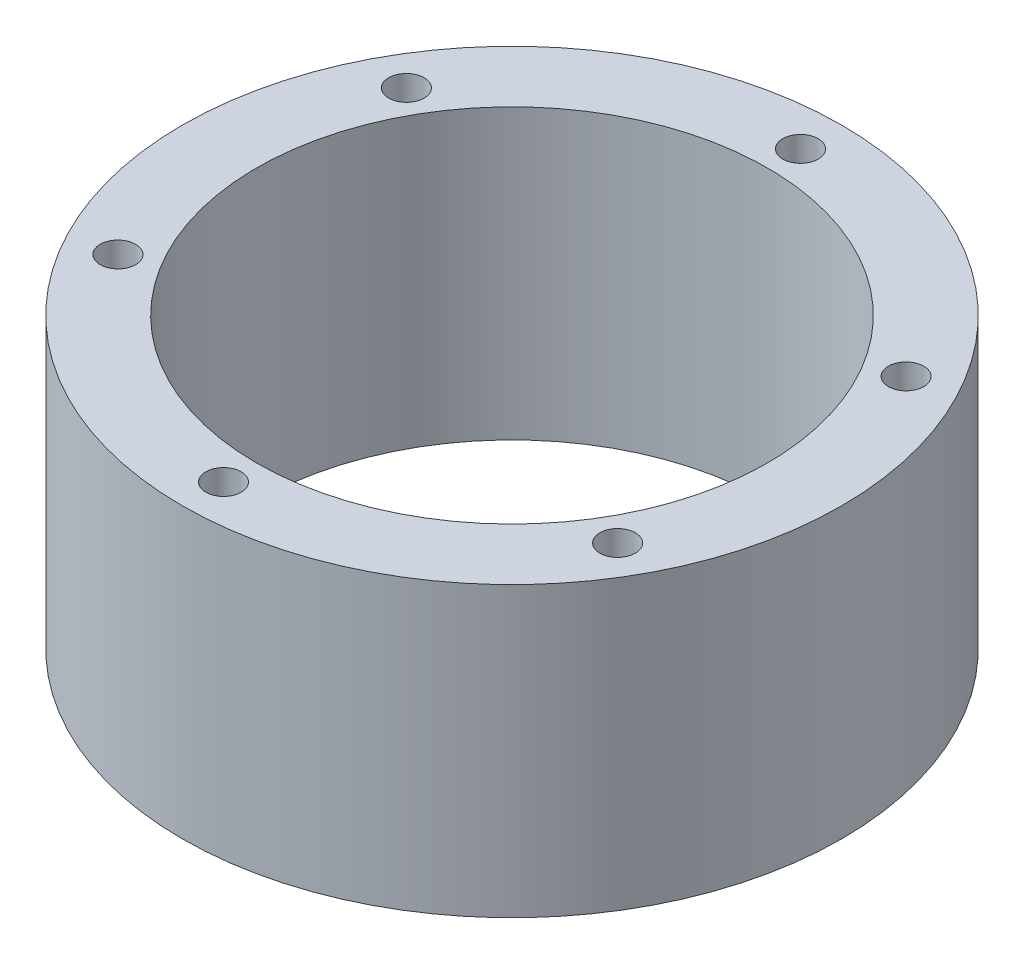
ISO-10303-21;
HEADER;
FILE_DESCRIPTION(('STEP AP214'),'2;1');
FILE_NAME('part.step','',(''),(''),'','','');
FILE_SCHEMA(('AUTOMOTIVE_DESIGN { 1 0 10303 214 1 1 1 1 }'));
ENDSEC;
DATA;
#1=APPLICATION_CONTEXT('core data for automotive mechanical design processes');
#2=APPLICATION_PROTOCOL_DEFINITION('international standard','automotive_design',2000,#1);
#3=PRODUCT_CONTEXT('',#1,'mechanical');
#4=PRODUCT('Part','Part','',(#3));
#5=PRODUCT_RELATED_PRODUCT_CATEGORY('part','',(#4));
#6=PRODUCT_DEFINITION_FORMATION('','',#4);
#7=PRODUCT_DEFINITION_CONTEXT('part definition',#1,'design');
#8=PRODUCT_DEFINITION('design','',#6,#7);
#9=PRODUCT_DEFINITION_SHAPE('','',#8);
#10=(LENGTH_UNIT() NAMED_UNIT(*) SI_UNIT(.MILLI.,.METRE.));
#11=(NAMED_UNIT(*) PLANE_ANGLE_UNIT() SI_UNIT($,.RADIAN.));
#12=(NAMED_UNIT(*) SI_UNIT($,.STERADIAN.) SOLID_ANGLE_UNIT());
#13=UNCERTAINTY_MEASURE_WITH_UNIT(LENGTH_MEASURE(1.E-05),#10,'distance_accuracy_value','');
#14=(GEOMETRIC_REPRESENTATION_CONTEXT(3) GLOBAL_UNCERTAINTY_ASSIGNED_CONTEXT((#13)) GLOBAL_UNIT_ASSIGNED_CONTEXT((#10,
#11,#12)) REPRESENTATION_CONTEXT('',''));
#15=CARTESIAN_POINT('',(0.,0.,0.));
#16=DIRECTION('',(0.,0.,1.));
#17=DIRECTION('',(1.,0.,0.));
#18=AXIS2_PLACEMENT_3D('',#15,#16,#17);
#19=CARTESIAN_POINT('',(0.,15.,0.));
#20=DIRECTION('',(0.,-1.,0.));
#21=DIRECTION('',(0.,0.,-1.));
#22=AXIS2_PLACEMENT_3D('',#19,#20,#21);
#23=CYLINDRICAL_SURFACE('',#22,31.);
#24=CARTESIAN_POINT('',(0.,0.,0.));
#25=DIRECTION('',(0.,1.,0.));
#26=DIRECTION('',(0.,0.,1.));
#27=AXIS2_PLACEMENT_3D('',#24,#25,#26);
#28=CIRCLE('',#27,31.);
#29=CARTESIAN_POINT('',(0.,0.,31.));
#30=VERTEX_POINT('',#29);
#31=EDGE_CURVE('E53',#30,#30,#28,.T.);
#32=ORIENTED_EDGE('',*,*,#31,.F.);
#33=EDGE_LOOP('',(#32));
#34=FACE_BOUND('',#33,.T.);
#35=CARTESIAN_POINT('',(0.,35.,0.));
#36=DIRECTION('',(0.,1.,0.));
#37=DIRECTION('',(0.,0.,1.));
#38=AXIS2_PLACEMENT_3D('',#35,#36,#37);
#39=CIRCLE('',#38,31.);
#40=CARTESIAN_POINT('',(0.,35.,31.));
#41=VERTEX_POINT('',#40);
#42=EDGE_CURVE('E89',#41,#41,#39,.T.);
#43=ORIENTED_EDGE('',*,*,#42,.T.);
#44=EDGE_LOOP('',(#43));
#45=FACE_BOUND('',#44,.T.);
#46=ADVANCED_FACE('F45',(#34,#45),#23,.F.);
#47=CARTESIAN_POINT('',(-30.3108891324552,15.,-17.5000000000004));
#48=DIRECTION('',(0.,-1.,0.));
#49=DIRECTION('',(0.,0.,-1.));
#50=AXIS2_PLACEMENT_3D('',#47,#48,#49);
#51=CYLINDRICAL_SURFACE('',#50,2.15);
#52=CARTESIAN_POINT('',(-30.3108891324552,0.,-17.5000000000004));
#53=DIRECTION('',(0.,1.,0.));
#54=DIRECTION('',(0.,0.,1.));
#55=AXIS2_PLACEMENT_3D('',#52,#53,#54);
#56=CIRCLE('',#55,2.15);
#57=CARTESIAN_POINT('',(-30.3108891324552,0.,-15.3500000000004));
#58=VERTEX_POINT('',#57);
#59=EDGE_CURVE('E58',#58,#58,#56,.T.);
#60=ORIENTED_EDGE('',*,*,#59,.F.);
#61=EDGE_LOOP('',(#60));
#62=FACE_BOUND('',#61,.T.);
#63=CARTESIAN_POINT('',(-30.3108891324552,35.,-17.5000000000004));
#64=DIRECTION('',(0.,1.,0.));
#65=DIRECTION('',(0.,0.,1.));
#66=AXIS2_PLACEMENT_3D('',#63,#64,#65);
#67=CIRCLE('',#66,2.15);
#68=CARTESIAN_POINT('',(-30.3108891324552,35.,-15.3500000000004));
#69=VERTEX_POINT('',#68);
#70=EDGE_CURVE('E113',#69,#69,#67,.T.);
#71=ORIENTED_EDGE('',*,*,#70,.T.);
#72=EDGE_LOOP('',(#71));
#73=FACE_BOUND('',#72,.T.);
#74=ADVANCED_FACE('F118',(#62,#73),#51,.F.);
#75=CARTESIAN_POINT('',(0.,15.,-35.));
#76=DIRECTION('',(0.,-1.,0.));
#77=DIRECTION('',(0.,0.,-1.));
#78=AXIS2_PLACEMENT_3D('',#75,#76,#77);
#79=CYLINDRICAL_SURFACE('',#78,2.15);
#80=CARTESIAN_POINT('',(0.,0.,-35.));
#81=DIRECTION('',(0.,1.,0.));
#82=DIRECTION('',(0.,0.,1.));
#83=AXIS2_PLACEMENT_3D('',#80,#81,#82);
#84=CIRCLE('',#83,2.15);
#85=CARTESIAN_POINT('',(0.,0.,-32.85));
#86=VERTEX_POINT('',#85);
#87=EDGE_CURVE('E63',#86,#86,#84,.T.);
#88=ORIENTED_EDGE('',*,*,#87,.F.);
#89=EDGE_LOOP('',(#88));
#90=FACE_BOUND('',#89,.T.);
#91=CARTESIAN_POINT('',(0.,35.,-35.));
#92=DIRECTION('',(0.,1.,0.));
#93=DIRECTION('',(0.,0.,1.));
#94=AXIS2_PLACEMENT_3D('',#91,#92,#93);
#95=CIRCLE('',#94,2.15);
#96=CARTESIAN_POINT('',(0.,35.,-32.85));
#97=VERTEX_POINT('',#96);
#98=EDGE_CURVE('E93',#97,#97,#95,.T.);
#99=ORIENTED_EDGE('',*,*,#98,.T.);
#100=EDGE_LOOP('',(#99));
#101=FACE_BOUND('',#100,.T.);
#102=ADVANCED_FACE('F140',(#90,#101),#79,.F.);
#103=CARTESIAN_POINT('',(30.3108891324554,15.,-17.4999999999999));
#104=DIRECTION('',(0.,-1.,0.));
#105=DIRECTION('',(0.,0.,-1.));
#106=AXIS2_PLACEMENT_3D('',#103,#104,#105);
#107=CYLINDRICAL_SURFACE('',#106,2.15);
#108=CARTESIAN_POINT('',(30.3108891324554,0.,-17.4999999999999));
#109=DIRECTION('',(0.,1.,0.));
#110=DIRECTION('',(0.,0.,1.));
#111=AXIS2_PLACEMENT_3D('',#108,#109,#110);
#112=CIRCLE('',#111,2.15);
#113=CARTESIAN_POINT('',(30.3108891324554,0.,-15.3499999999999));
#114=VERTEX_POINT('',#113);
#115=EDGE_CURVE('E69',#114,#114,#112,.T.);
#116=ORIENTED_EDGE('',*,*,#115,.F.);
#117=EDGE_LOOP('',(#116));
#118=FACE_BOUND('',#117,.T.);
#119=CARTESIAN_POINT('',(30.3108891324554,35.,-17.4999999999999));
#120=DIRECTION('',(0.,1.,0.));
#121=DIRECTION('',(0.,0.,1.));
#122=AXIS2_PLACEMENT_3D('',#119,#120,#121);
#123=CIRCLE('',#122,2.15);
#124=CARTESIAN_POINT('',(30.3108891324554,35.,-15.3499999999999));
#125=VERTEX_POINT('',#124);
#126=EDGE_CURVE('E97',#125,#125,#123,.T.);
#127=ORIENTED_EDGE('',*,*,#126,.T.);
#128=EDGE_LOOP('',(#127));
#129=FACE_BOUND('',#128,.T.);
#130=ADVANCED_FACE('F148',(#118,#129),#107,.F.);
#131=CARTESIAN_POINT('',(30.3108891324553,15.,17.5000000000001));
#132=DIRECTION('',(0.,-1.,0.));
#133=DIRECTION('',(0.,0.,-1.));
#134=AXIS2_PLACEMENT_3D('',#131,#132,#133);
#135=CYLINDRICAL_SURFACE('',#134,2.15);
#136=CARTESIAN_POINT('',(30.3108891324553,0.,17.5000000000001));
#137=DIRECTION('',(0.,1.,0.));
#138=DIRECTION('',(0.,0.,1.));
#139=AXIS2_PLACEMENT_3D('',#136,#137,#138);
#140=CIRCLE('',#139,2.15);
#141=CARTESIAN_POINT('',(30.3108891324553,0.,19.6500000000001));
#142=VERTEX_POINT('',#141);
#143=EDGE_CURVE('E73',#142,#142,#140,.T.);
#144=ORIENTED_EDGE('',*,*,#143,.F.);
#145=EDGE_LOOP('',(#144));
#146=FACE_BOUND('',#145,.T.);
#147=CARTESIAN_POINT('',(30.3108891324553,35.,17.5000000000001));
#148=DIRECTION('',(0.,1.,0.));
#149=DIRECTION('',(0.,0.,1.));
#150=AXIS2_PLACEMENT_3D('',#147,#148,#149);
#151=CIRCLE('',#150,2.15);
#152=CARTESIAN_POINT('',(30.3108891324553,35.,19.6500000000001));
#153=VERTEX_POINT('',#152);
#154=EDGE_CURVE('E101',#153,#153,#151,.T.);
#155=ORIENTED_EDGE('',*,*,#154,.T.);
#156=EDGE_LOOP('',(#155));
#157=FACE_BOUND('',#156,.T.);
#158=ADVANCED_FACE('F152',(#146,#157),#135,.F.);
#159=CARTESIAN_POINT('',(-2.44403693719019E-13,15.,35.));
#160=DIRECTION('',(0.,-1.,0.));
#161=DIRECTION('',(0.,0.,-1.));
#162=AXIS2_PLACEMENT_3D('',#159,#160,#161);
#163=CYLINDRICAL_SURFACE('',#162,2.15);
#164=CARTESIAN_POINT('',(-2.44403693719019E-13,0.,35.));
#165=DIRECTION('',(0.,1.,0.));
#166=DIRECTION('',(0.,0.,1.));
#167=AXIS2_PLACEMENT_3D('',#164,#165,#166);
#168=CIRCLE('',#167,2.15);
#169=CARTESIAN_POINT('',(-2.44403693719019E-13,0.,37.15));
#170=VERTEX_POINT('',#169);
#171=EDGE_CURVE('E77',#170,#170,#168,.T.);
#172=ORIENTED_EDGE('',*,*,#171,.F.);
#173=EDGE_LOOP('',(#172));
#174=FACE_BOUND('',#173,.T.);
#175=CARTESIAN_POINT('',(-2.44403693719019E-13,35.,35.));
#176=DIRECTION('',(0.,1.,0.));
#177=DIRECTION('',(0.,0.,1.));
#178=AXIS2_PLACEMENT_3D('',#175,#176,#177);
#179=CIRCLE('',#178,2.15);
#180=CARTESIAN_POINT('',(-2.44403693719019E-13,35.,37.15));
#181=VERTEX_POINT('',#180);
#182=EDGE_CURVE('E105',#181,#181,#179,.T.);
#183=ORIENTED_EDGE('',*,*,#182,.T.);
#184=EDGE_LOOP('',(#183));
#185=FACE_BOUND('',#184,.T.);
#186=ADVANCED_FACE('F155',(#174,#185),#163,.F.);
#187=CARTESIAN_POINT('',(-30.3108891324555,15.,17.4999999999997));
#188=DIRECTION('',(0.,-1.,0.));
#189=DIRECTION('',(0.,0.,-1.));
#190=AXIS2_PLACEMENT_3D('',#187,#188,#189);
#191=CYLINDRICAL_SURFACE('',#190,2.15);
#192=CARTESIAN_POINT('',(-30.3108891324555,0.,17.4999999999997));
#193=DIRECTION('',(0.,1.,0.));
#194=DIRECTION('',(0.,0.,1.));
#195=AXIS2_PLACEMENT_3D('',#192,#193,#194);
#196=CIRCLE('',#195,2.15);
#197=CARTESIAN_POINT('',(-30.3108891324555,0.,19.6499999999997));
#198=VERTEX_POINT('',#197);
#199=EDGE_CURVE('E81',#198,#198,#196,.T.);
#200=ORIENTED_EDGE('',*,*,#199,.F.);
#201=EDGE_LOOP('',(#200));
#202=FACE_BOUND('',#201,.T.);
#203=CARTESIAN_POINT('',(-30.3108891324555,35.,17.4999999999997));
#204=DIRECTION('',(0.,1.,0.));
#205=DIRECTION('',(0.,0.,1.));
#206=AXIS2_PLACEMENT_3D('',#203,#204,#205);
#207=CIRCLE('',#206,2.15);
#208=CARTESIAN_POINT('',(-30.3108891324555,35.,19.6499999999997));
#209=VERTEX_POINT('',#208);
#210=EDGE_CURVE('E109',#209,#209,#207,.T.);
#211=ORIENTED_EDGE('',*,*,#210,.T.);
#212=EDGE_LOOP('',(#211));
#213=FACE_BOUND('',#212,.T.);
#214=ADVANCED_FACE('F47',(#202,#213),#191,.F.);
#215=CARTESIAN_POINT('',(0.,15.,0.));
#216=DIRECTION('',(0.,-1.,0.));
#217=DIRECTION('',(0.,0.,-1.));
#218=AXIS2_PLACEMENT_3D('',#215,#216,#217);
#219=CYLINDRICAL_SURFACE('',#218,40.);
#220=CARTESIAN_POINT('',(0.,0.,0.));
#221=DIRECTION('',(0.,1.,0.));
#222=DIRECTION('',(0.,0.,1.));
#223=AXIS2_PLACEMENT_3D('',#220,#221,#222);
#224=CIRCLE('',#223,40.);
#225=CARTESIAN_POINT('',(0.,0.,40.));
#226=VERTEX_POINT('',#225);
#227=EDGE_CURVE('E10',#226,#226,#224,.T.);
#228=ORIENTED_EDGE('',*,*,#227,.T.);
#229=EDGE_LOOP('',(#228));
#230=FACE_BOUND('',#229,.T.);
#231=CARTESIAN_POINT('',(0.,35.,0.));
#232=DIRECTION('',(0.,1.,0.));
#233=DIRECTION('',(0.,0.,1.));
#234=AXIS2_PLACEMENT_3D('',#231,#232,#233);
#235=CIRCLE('',#234,40.);
#236=CARTESIAN_POINT('',(0.,35.,40.));
#237=VERTEX_POINT('',#236);
#238=EDGE_CURVE('E85',#237,#237,#235,.T.);
#239=ORIENTED_EDGE('',*,*,#238,.F.);
#240=EDGE_LOOP('',(#239));
#241=FACE_BOUND('',#240,.T.);
#242=ADVANCED_FACE('F129',(#230,#241),#219,.T.);
#243=CARTESIAN_POINT('',(0.,0.,0.));
#244=DIRECTION('',(0.,1.,0.));
#245=DIRECTION('',(0.,0.,1.));
#246=AXIS2_PLACEMENT_3D('',#243,#244,#245);
#247=PLANE('',#246);
#248=ORIENTED_EDGE('',*,*,#199,.T.);
#249=EDGE_LOOP('',(#248));
#250=FACE_BOUND('',#249,.T.);
#251=ORIENTED_EDGE('',*,*,#171,.T.);
#252=EDGE_LOOP('',(#251));
#253=FACE_BOUND('',#252,.T.);
#254=ORIENTED_EDGE('',*,*,#143,.T.);
#255=EDGE_LOOP('',(#254));
#256=FACE_BOUND('',#255,.T.);
#257=ORIENTED_EDGE('',*,*,#115,.T.);
#258=EDGE_LOOP('',(#257));
#259=FACE_BOUND('',#258,.T.);
#260=ORIENTED_EDGE('',*,*,#87,.T.);
#261=EDGE_LOOP('',(#260));
#262=FACE_BOUND('',#261,.T.);
#263=ORIENTED_EDGE('',*,*,#59,.T.);
#264=EDGE_LOOP('',(#263));
#265=FACE_BOUND('',#264,.T.);
#266=ORIENTED_EDGE('',*,*,#31,.T.);
#267=EDGE_LOOP('',(#266));
#268=FACE_BOUND('',#267,.T.);
#269=ORIENTED_EDGE('',*,*,#227,.F.);
#270=EDGE_LOOP('',(#269));
#271=FACE_BOUND('',#270,.T.);
#272=ADVANCED_FACE('F122',(#250,#253,#256,#259,#262,#265,#268,#271),#247,.F.);
#273=CARTESIAN_POINT('',(0.,35.,0.));
#274=DIRECTION('',(0.,1.,0.));
#275=DIRECTION('',(0.,0.,1.));
#276=AXIS2_PLACEMENT_3D('',#273,#274,#275);
#277=PLANE('',#276);
#278=ORIENTED_EDGE('',*,*,#210,.F.);
#279=EDGE_LOOP('',(#278));
#280=FACE_BOUND('',#279,.T.);
#281=ORIENTED_EDGE('',*,*,#154,.F.);
#282=EDGE_LOOP('',(#281));
#283=FACE_BOUND('',#282,.T.);
#284=ORIENTED_EDGE('',*,*,#98,.F.);
#285=EDGE_LOOP('',(#284));
#286=FACE_BOUND('',#285,.T.);
#287=ORIENTED_EDGE('',*,*,#238,.T.);
#288=EDGE_LOOP('',(#287));
#289=FACE_BOUND('',#288,.T.);
#290=ORIENTED_EDGE('',*,*,#42,.F.);
#291=EDGE_LOOP('',(#290));
#292=FACE_BOUND('',#291,.T.);
#293=ORIENTED_EDGE('',*,*,#126,.F.);
#294=EDGE_LOOP('',(#293));
#295=FACE_BOUND('',#294,.T.);
#296=ORIENTED_EDGE('',*,*,#182,.F.);
#297=EDGE_LOOP('',(#296));
#298=FACE_BOUND('',#297,.T.);
#299=ORIENTED_EDGE('',*,*,#70,.F.);
#300=EDGE_LOOP('',(#299));
#301=FACE_BOUND('',#300,.T.);
#302=ADVANCED_FACE('F120',(#280,#283,#286,#289,#292,#295,#298,#301),#277,.T.);
#303=CLOSED_SHELL('',(#46,#74,#102,#130,#158,#186,#214,#242,#272,#302));
#304=MANIFOLD_SOLID_BREP('B2',#303);
#305=ADVANCED_BREP_SHAPE_REPRESENTATION('',(#18,#304),#14);
#306=SHAPE_DEFINITION_REPRESENTATION(#9,#305);
ENDSEC;
END-ISO-10303-21;
